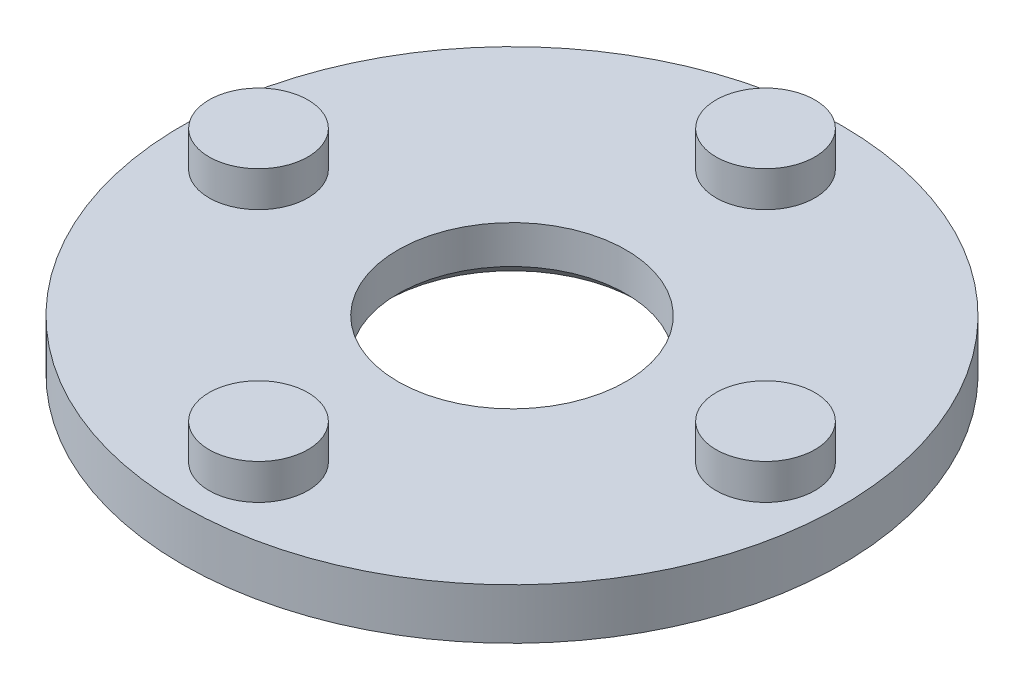
ISO-10303-21;
HEADER;
FILE_DESCRIPTION(('STEP AP214'),'2;1');
FILE_NAME('part.step','',(''),(''),'','','');
FILE_SCHEMA(('AUTOMOTIVE_DESIGN { 1 0 10303 214 1 1 1 1 }'));
ENDSEC;
DATA;
#1=APPLICATION_CONTEXT('core data for automotive mechanical design processes');
#2=APPLICATION_PROTOCOL_DEFINITION('international standard','automotive_design',2000,#1);
#3=PRODUCT_CONTEXT('',#1,'mechanical');
#4=PRODUCT('Part','Part','',(#3));
#5=PRODUCT_RELATED_PRODUCT_CATEGORY('part','',(#4));
#6=PRODUCT_DEFINITION_FORMATION('','',#4);
#7=PRODUCT_DEFINITION_CONTEXT('part definition',#1,'design');
#8=PRODUCT_DEFINITION('design','',#6,#7);
#9=PRODUCT_DEFINITION_SHAPE('','',#8);
#10=(LENGTH_UNIT() NAMED_UNIT(*) SI_UNIT(.MILLI.,.METRE.));
#11=(NAMED_UNIT(*) PLANE_ANGLE_UNIT() SI_UNIT($,.RADIAN.));
#12=(NAMED_UNIT(*) SI_UNIT($,.STERADIAN.) SOLID_ANGLE_UNIT());
#13=UNCERTAINTY_MEASURE_WITH_UNIT(LENGTH_MEASURE(1.E-05),#10,'distance_accuracy_value','');
#14=(GEOMETRIC_REPRESENTATION_CONTEXT(3) GLOBAL_UNCERTAINTY_ASSIGNED_CONTEXT((#13)) GLOBAL_UNIT_ASSIGNED_CONTEXT((#10,
#11,#12)) REPRESENTATION_CONTEXT('',''));
#15=CARTESIAN_POINT('',(0.,0.,0.));
#16=DIRECTION('',(0.,0.,1.));
#17=DIRECTION('',(1.,0.,0.));
#18=AXIS2_PLACEMENT_3D('',#15,#16,#17);
#19=CARTESIAN_POINT('',(0.,2.,0.));
#20=DIRECTION('',(0.,-1.,0.));
#21=DIRECTION('',(0.,0.,-1.));
#22=AXIS2_PLACEMENT_3D('',#19,#20,#21);
#23=CYLINDRICAL_SURFACE('',#22,13.);
#24=CARTESIAN_POINT('',(0.,2.,0.));
#25=DIRECTION('',(0.,1.,0.));
#26=DIRECTION('',(0.,0.,1.));
#27=AXIS2_PLACEMENT_3D('',#24,#25,#26);
#28=CIRCLE('',#27,13.);
#29=CARTESIAN_POINT('',(0.,2.,13.));
#30=VERTEX_POINT('',#29);
#31=EDGE_CURVE('E43',#30,#30,#28,.T.);
#32=ORIENTED_EDGE('',*,*,#31,.F.);
#33=EDGE_LOOP('',(#32));
#34=FACE_BOUND('',#33,.T.);
#35=CARTESIAN_POINT('',(0.,0.,0.));
#36=DIRECTION('',(0.,1.,0.));
#37=DIRECTION('',(0.,0.,1.));
#38=AXIS2_PLACEMENT_3D('',#35,#36,#37);
#39=CIRCLE('',#38,13.);
#40=CARTESIAN_POINT('',(0.,0.,13.));
#41=VERTEX_POINT('',#40);
#42=EDGE_CURVE('E47',#41,#41,#39,.T.);
#43=ORIENTED_EDGE('',*,*,#42,.T.);
#44=EDGE_LOOP('',(#43));
#45=FACE_BOUND('',#44,.T.);
#46=ADVANCED_FACE('F32',(#34,#45),#23,.T.);
#47=CARTESIAN_POINT('',(0.,2.,0.));
#48=DIRECTION('',(0.,1.,0.));
#49=DIRECTION('',(0.,0.,1.));
#50=AXIS2_PLACEMENT_3D('',#47,#48,#49);
#51=PLANE('',#50);
#52=CARTESIAN_POINT('',(0.,2.,10.));
#53=DIRECTION('',(0.,1.,0.));
#54=DIRECTION('',(0.,0.,1.));
#55=AXIS2_PLACEMENT_3D('',#52,#53,#54);
#56=CIRCLE('',#55,1.95);
#57=CARTESIAN_POINT('',(0.,2.,11.95));
#58=VERTEX_POINT('',#57);
#59=EDGE_CURVE('E74',#58,#58,#56,.T.);
#60=ORIENTED_EDGE('',*,*,#59,.F.);
#61=EDGE_LOOP('',(#60));
#62=FACE_BOUND('',#61,.T.);
#63=CARTESIAN_POINT('',(-10.,2.,0.));
#64=DIRECTION('',(0.,1.,0.));
#65=DIRECTION('',(0.,0.,1.));
#66=AXIS2_PLACEMENT_3D('',#63,#64,#65);
#67=CIRCLE('',#66,1.95);
#68=CARTESIAN_POINT('',(-10.,2.,1.95));
#69=VERTEX_POINT('',#68);
#70=EDGE_CURVE('E68',#69,#69,#67,.T.);
#71=ORIENTED_EDGE('',*,*,#70,.F.);
#72=EDGE_LOOP('',(#71));
#73=FACE_BOUND('',#72,.T.);
#74=CARTESIAN_POINT('',(10.,2.,0.));
#75=DIRECTION('',(0.,1.,0.));
#76=DIRECTION('',(0.,0.,1.));
#77=AXIS2_PLACEMENT_3D('',#74,#75,#76);
#78=CIRCLE('',#77,1.95);
#79=CARTESIAN_POINT('',(10.,2.,1.95));
#80=VERTEX_POINT('',#79);
#81=EDGE_CURVE('E62',#80,#80,#78,.T.);
#82=ORIENTED_EDGE('',*,*,#81,.F.);
#83=EDGE_LOOP('',(#82));
#84=FACE_BOUND('',#83,.T.);
#85=CARTESIAN_POINT('',(0.,2.,-10.));
#86=DIRECTION('',(0.,1.,0.));
#87=DIRECTION('',(0.,0.,1.));
#88=AXIS2_PLACEMENT_3D('',#85,#86,#87);
#89=CIRCLE('',#88,1.95);
#90=CARTESIAN_POINT('',(0.,2.,-8.05));
#91=VERTEX_POINT('',#90);
#92=EDGE_CURVE('E56',#91,#91,#89,.T.);
#93=ORIENTED_EDGE('',*,*,#92,.F.);
#94=EDGE_LOOP('',(#93));
#95=FACE_BOUND('',#94,.T.);
#96=CARTESIAN_POINT('',(0.,2.,0.));
#97=DIRECTION('',(0.,1.,0.));
#98=DIRECTION('',(0.,0.,1.));
#99=AXIS2_PLACEMENT_3D('',#96,#97,#98);
#100=CIRCLE('',#99,4.5);
#101=CARTESIAN_POINT('',(0.,2.,4.5));
#102=VERTEX_POINT('',#101);
#103=EDGE_CURVE('E51',#102,#102,#100,.T.);
#104=ORIENTED_EDGE('',*,*,#103,.F.);
#105=EDGE_LOOP('',(#104));
#106=FACE_BOUND('',#105,.T.);
#107=ORIENTED_EDGE('',*,*,#31,.T.);
#108=EDGE_LOOP('',(#107));
#109=FACE_BOUND('',#108,.T.);
#110=ADVANCED_FACE('F89',(#62,#73,#84,#95,#106,#109),#51,.T.);
#111=CARTESIAN_POINT('',(0.,0.,0.));
#112=DIRECTION('',(0.,1.,0.));
#113=DIRECTION('',(0.,0.,1.));
#114=AXIS2_PLACEMENT_3D('',#111,#112,#113);
#115=PLANE('',#114);
#116=CARTESIAN_POINT('',(0.,0.,0.));
#117=DIRECTION('',(0.,1.,0.));
#118=DIRECTION('',(0.,0.,1.));
#119=AXIS2_PLACEMENT_3D('',#116,#117,#118);
#120=CIRCLE('',#119,5.);
#121=CARTESIAN_POINT('',(0.,0.,5.));
#122=VERTEX_POINT('',#121);
#123=EDGE_CURVE('E39',#122,#122,#120,.T.);
#124=ORIENTED_EDGE('',*,*,#123,.T.);
#125=EDGE_LOOP('',(#124));
#126=FACE_BOUND('',#125,.T.);
#127=ORIENTED_EDGE('',*,*,#42,.F.);
#128=EDGE_LOOP('',(#127));
#129=FACE_BOUND('',#128,.T.);
#130=ADVANCED_FACE('F92',(#126,#129),#115,.F.);
#131=CARTESIAN_POINT('',(0.,0.,0.));
#132=DIRECTION('',(0.,1.,0.));
#133=DIRECTION('',(0.,0.,1.));
#134=AXIS2_PLACEMENT_3D('',#131,#132,#133);
#135=CYLINDRICAL_SURFACE('',#134,4.5);
#136=CARTESIAN_POINT('',(0.,0.500000000000003,0.));
#137=DIRECTION('',(0.,1.,0.));
#138=DIRECTION('',(0.,0.,1.));
#139=AXIS2_PLACEMENT_3D('',#136,#137,#138);
#140=CIRCLE('',#139,4.5);
#141=CARTESIAN_POINT('',(0.,0.500000000000003,4.5));
#142=VERTEX_POINT('',#141);
#143=EDGE_CURVE('E10',#142,#142,#140,.F.);
#144=ORIENTED_EDGE('',*,*,#143,.T.);
#145=EDGE_LOOP('',(#144));
#146=FACE_BOUND('',#145,.T.);
#147=ORIENTED_EDGE('',*,*,#103,.T.);
#148=EDGE_LOOP('',(#147));
#149=FACE_BOUND('',#148,.T.);
#150=ADVANCED_FACE('F109',(#146,#149),#135,.F.);
#151=CARTESIAN_POINT('',(0.,3.4,-10.));
#152=DIRECTION('',(0.,-1.,0.));
#153=DIRECTION('',(0.,0.,-1.));
#154=AXIS2_PLACEMENT_3D('',#151,#152,#153);
#155=CYLINDRICAL_SURFACE('',#154,1.95);
#156=CARTESIAN_POINT('',(0.,3.4,-10.));
#157=DIRECTION('',(0.,1.,0.));
#158=DIRECTION('',(0.,0.,1.));
#159=AXIS2_PLACEMENT_3D('',#156,#157,#158);
#160=CIRCLE('',#159,1.95);
#161=CARTESIAN_POINT('',(0.,3.4,-8.05));
#162=VERTEX_POINT('',#161);
#163=EDGE_CURVE('E55',#162,#162,#160,.T.);
#164=ORIENTED_EDGE('',*,*,#163,.F.);
#165=EDGE_LOOP('',(#164));
#166=FACE_BOUND('',#165,.T.);
#167=ORIENTED_EDGE('',*,*,#92,.T.);
#168=EDGE_LOOP('',(#167));
#169=FACE_BOUND('',#168,.T.);
#170=ADVANCED_FACE('F114',(#166,#169),#155,.T.);
#171=CARTESIAN_POINT('',(0.,3.4,-10.));
#172=DIRECTION('',(0.,1.,0.));
#173=DIRECTION('',(0.,0.,1.));
#174=AXIS2_PLACEMENT_3D('',#171,#172,#173);
#175=PLANE('',#174);
#176=ORIENTED_EDGE('',*,*,#163,.T.);
#177=EDGE_LOOP('',(#176));
#178=FACE_BOUND('',#177,.T.);
#179=ADVANCED_FACE('F119',(#178),#175,.T.);
#180=CARTESIAN_POINT('',(10.,3.4,0.));
#181=DIRECTION('',(0.,-1.,0.));
#182=DIRECTION('',(0.,0.,-1.));
#183=AXIS2_PLACEMENT_3D('',#180,#181,#182);
#184=CYLINDRICAL_SURFACE('',#183,1.95);
#185=CARTESIAN_POINT('',(10.,3.4,0.));
#186=DIRECTION('',(0.,1.,0.));
#187=DIRECTION('',(0.,0.,1.));
#188=AXIS2_PLACEMENT_3D('',#185,#186,#187);
#189=CIRCLE('',#188,1.95);
#190=CARTESIAN_POINT('',(10.,3.4,1.95));
#191=VERTEX_POINT('',#190);
#192=EDGE_CURVE('E59',#191,#191,#189,.T.);
#193=ORIENTED_EDGE('',*,*,#192,.F.);
#194=EDGE_LOOP('',(#193));
#195=FACE_BOUND('',#194,.T.);
#196=ORIENTED_EDGE('',*,*,#81,.T.);
#197=EDGE_LOOP('',(#196));
#198=FACE_BOUND('',#197,.T.);
#199=ADVANCED_FACE('F123',(#195,#198),#184,.T.);
#200=CARTESIAN_POINT('',(10.,3.4,0.));
#201=DIRECTION('',(0.,1.,0.));
#202=DIRECTION('',(0.,0.,1.));
#203=AXIS2_PLACEMENT_3D('',#200,#201,#202);
#204=PLANE('',#203);
#205=ORIENTED_EDGE('',*,*,#192,.T.);
#206=EDGE_LOOP('',(#205));
#207=FACE_BOUND('',#206,.T.);
#208=ADVANCED_FACE('F127',(#207),#204,.T.);
#209=CARTESIAN_POINT('',(-10.,3.4,0.));
#210=DIRECTION('',(0.,-1.,0.));
#211=DIRECTION('',(0.,0.,-1.));
#212=AXIS2_PLACEMENT_3D('',#209,#210,#211);
#213=CYLINDRICAL_SURFACE('',#212,1.95);
#214=CARTESIAN_POINT('',(-10.,3.4,0.));
#215=DIRECTION('',(0.,1.,0.));
#216=DIRECTION('',(0.,0.,1.));
#217=AXIS2_PLACEMENT_3D('',#214,#215,#216);
#218=CIRCLE('',#217,1.95);
#219=CARTESIAN_POINT('',(-10.,3.4,1.95));
#220=VERTEX_POINT('',#219);
#221=EDGE_CURVE('E65',#220,#220,#218,.T.);
#222=ORIENTED_EDGE('',*,*,#221,.F.);
#223=EDGE_LOOP('',(#222));
#224=FACE_BOUND('',#223,.T.);
#225=ORIENTED_EDGE('',*,*,#70,.T.);
#226=EDGE_LOOP('',(#225));
#227=FACE_BOUND('',#226,.T.);
#228=ADVANCED_FACE('F131',(#224,#227),#213,.T.);
#229=CARTESIAN_POINT('',(-10.,3.4,0.));
#230=DIRECTION('',(0.,1.,0.));
#231=DIRECTION('',(0.,0.,1.));
#232=AXIS2_PLACEMENT_3D('',#229,#230,#231);
#233=PLANE('',#232);
#234=ORIENTED_EDGE('',*,*,#221,.T.);
#235=EDGE_LOOP('',(#234));
#236=FACE_BOUND('',#235,.T.);
#237=ADVANCED_FACE('F85',(#236),#233,.T.);
#238=CARTESIAN_POINT('',(0.,3.4,10.));
#239=DIRECTION('',(0.,-1.,0.));
#240=DIRECTION('',(0.,0.,-1.));
#241=AXIS2_PLACEMENT_3D('',#238,#239,#240);
#242=CYLINDRICAL_SURFACE('',#241,1.95);
#243=CARTESIAN_POINT('',(0.,3.4,10.));
#244=DIRECTION('',(0.,1.,0.));
#245=DIRECTION('',(0.,0.,1.));
#246=AXIS2_PLACEMENT_3D('',#243,#244,#245);
#247=CIRCLE('',#246,1.95);
#248=CARTESIAN_POINT('',(0.,3.4,11.95));
#249=VERTEX_POINT('',#248);
#250=EDGE_CURVE('E71',#249,#249,#247,.T.);
#251=ORIENTED_EDGE('',*,*,#250,.F.);
#252=EDGE_LOOP('',(#251));
#253=FACE_BOUND('',#252,.T.);
#254=ORIENTED_EDGE('',*,*,#59,.T.);
#255=EDGE_LOOP('',(#254));
#256=FACE_BOUND('',#255,.T.);
#257=ADVANCED_FACE('F82',(#253,#256),#242,.T.);
#258=CARTESIAN_POINT('',(0.,3.4,10.));
#259=DIRECTION('',(0.,1.,0.));
#260=DIRECTION('',(0.,0.,1.));
#261=AXIS2_PLACEMENT_3D('',#258,#259,#260);
#262=PLANE('',#261);
#263=ORIENTED_EDGE('',*,*,#250,.T.);
#264=EDGE_LOOP('',(#263));
#265=FACE_BOUND('',#264,.T.);
#266=ADVANCED_FACE('F80',(#265),#262,.T.);
#267=CARTESIAN_POINT('',(0.,0.,0.));
#268=DIRECTION('',(0.,-1.,0.));
#269=DIRECTION('',(0.,0.,-1.));
#270=AXIS2_PLACEMENT_3D('',#267,#268,#269);
#271=CONICAL_SURFACE('',#270,5.,0.785398163397447);
#272=ORIENTED_EDGE('',*,*,#143,.F.);
#273=EDGE_LOOP('',(#272));
#274=FACE_BOUND('',#273,.T.);
#275=ORIENTED_EDGE('',*,*,#123,.F.);
#276=EDGE_LOOP('',(#275));
#277=FACE_BOUND('',#276,.T.);
#278=ADVANCED_FACE('F34',(#274,#277),#271,.F.);
#279=CLOSED_SHELL('',(#46,#110,#130,#150,#170,#179,#199,#208,#228,#237,#257,#266,#278));
#280=MANIFOLD_SOLID_BREP('B2',#279);
#281=ADVANCED_BREP_SHAPE_REPRESENTATION('',(#18,#280),#14);
#282=SHAPE_DEFINITION_REPRESENTATION(#9,#281);
ENDSEC;
END-ISO-10303-21;
